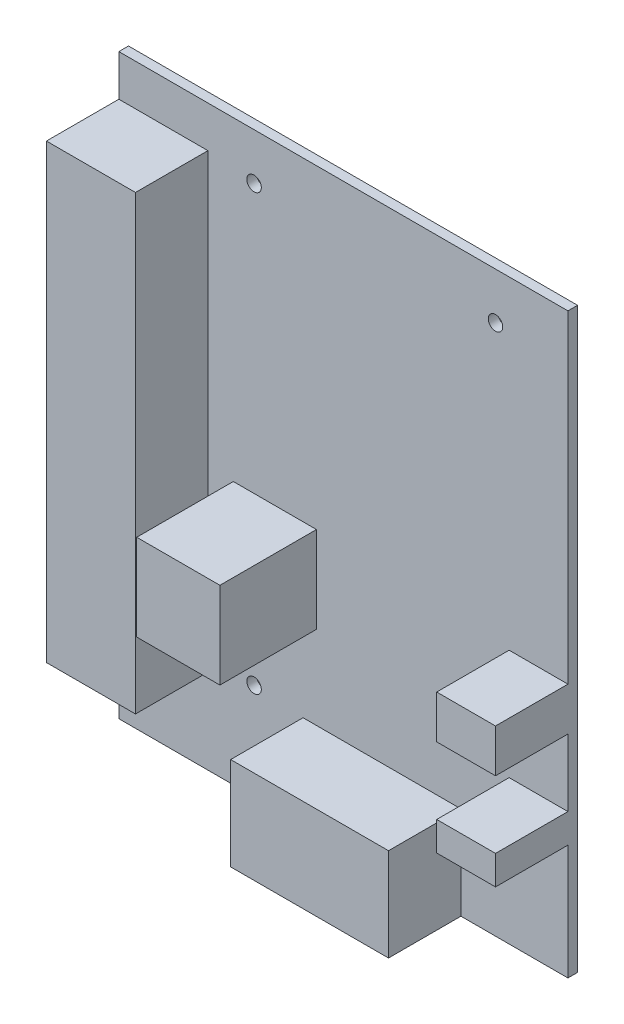
ISO-10303-21;
HEADER;
FILE_DESCRIPTION(('STEP AP214'),'2;1');
FILE_NAME('part.step','',(''),(''),'','','');
FILE_SCHEMA(('AUTOMOTIVE_DESIGN { 1 0 10303 214 1 1 1 1 }'));
ENDSEC;
DATA;
#1=APPLICATION_CONTEXT('core data for automotive mechanical design processes');
#2=APPLICATION_PROTOCOL_DEFINITION('international standard','automotive_design',2000,#1);
#3=PRODUCT_CONTEXT('',#1,'mechanical');
#4=PRODUCT('Part','Part','',(#3));
#5=PRODUCT_RELATED_PRODUCT_CATEGORY('part','',(#4));
#6=PRODUCT_DEFINITION_FORMATION('','',#4);
#7=PRODUCT_DEFINITION_CONTEXT('part definition',#1,'design');
#8=PRODUCT_DEFINITION('design','',#6,#7);
#9=PRODUCT_DEFINITION_SHAPE('','',#8);
#10=(LENGTH_UNIT() NAMED_UNIT(*) SI_UNIT(.MILLI.,.METRE.));
#11=(NAMED_UNIT(*) PLANE_ANGLE_UNIT() SI_UNIT($,.RADIAN.));
#12=(NAMED_UNIT(*) SI_UNIT($,.STERADIAN.) SOLID_ANGLE_UNIT());
#13=UNCERTAINTY_MEASURE_WITH_UNIT(LENGTH_MEASURE(1.E-05),#10,'distance_accuracy_value','');
#14=(GEOMETRIC_REPRESENTATION_CONTEXT(3) GLOBAL_UNCERTAINTY_ASSIGNED_CONTEXT((#13)) GLOBAL_UNIT_ASSIGNED_CONTEXT((#10,
#11,#12)) REPRESENTATION_CONTEXT('',''));
#15=CARTESIAN_POINT('',(0.,0.,0.));
#16=DIRECTION('',(0.,0.,1.));
#17=DIRECTION('',(1.,0.,0.));
#18=AXIS2_PLACEMENT_3D('',#15,#16,#17);
#19=CARTESIAN_POINT('',(0.,0.,2.));
#20=DIRECTION('',(0.,0.,1.));
#21=DIRECTION('',(1.,0.,0.));
#22=AXIS2_PLACEMENT_3D('',#19,#20,#21);
#23=PLANE('',#22);
#24=CARTESIAN_POINT('',(11.7886178861789,-47.520325203252,2.));
#25=DIRECTION('',(0.,0.,1.));
#26=DIRECTION('',(1.,0.,0.));
#27=AXIS2_PLACEMENT_3D('',#24,#25,#26);
#28=CIRCLE('',#27,1.5);
#29=CARTESIAN_POINT('',(13.2886178861789,-47.520325203252,2.));
#30=VERTEX_POINT('',#29);
#31=EDGE_CURVE('E350',#30,#30,#28,.T.);
#32=ORIENTED_EDGE('',*,*,#31,.F.);
#33=EDGE_LOOP('',(#32));
#34=FACE_BOUND('',#33,.T.);
#35=CARTESIAN_POINT('',(-38.2113821138211,42.479674796748,2.));
#36=DIRECTION('',(0.,0.,1.));
#37=DIRECTION('',(1.,0.,0.));
#38=AXIS2_PLACEMENT_3D('',#35,#36,#37);
#39=CIRCLE('',#38,1.5);
#40=CARTESIAN_POINT('',(-36.7113821138211,42.479674796748,2.));
#41=VERTEX_POINT('',#40);
#42=EDGE_CURVE('E362',#41,#41,#39,.T.);
#43=ORIENTED_EDGE('',*,*,#42,.F.);
#44=EDGE_LOOP('',(#43));
#45=FACE_BOUND('',#44,.T.);
#46=CARTESIAN_POINT('',(11.7886178861789,42.479674796748,2.));
#47=DIRECTION('',(0.,0.,1.));
#48=DIRECTION('',(1.,0.,0.));
#49=AXIS2_PLACEMENT_3D('',#46,#47,#48);
#50=CIRCLE('',#49,1.5);
#51=CARTESIAN_POINT('',(13.2886178861789,42.479674796748,2.));
#52=VERTEX_POINT('',#51);
#53=EDGE_CURVE('E356',#52,#52,#50,.T.);
#54=ORIENTED_EDGE('',*,*,#53,.F.);
#55=EDGE_LOOP('',(#54));
#56=FACE_BOUND('',#55,.T.);
#57=CARTESIAN_POINT('',(-38.2113821138211,-47.520325203252,2.));
#58=DIRECTION('',(0.,0.,1.));
#59=DIRECTION('',(1.,0.,0.));
#60=AXIS2_PLACEMENT_3D('',#57,#58,#59);
#61=CIRCLE('',#60,1.5);
#62=CARTESIAN_POINT('',(-36.7113821138211,-47.520325203252,2.));
#63=VERTEX_POINT('',#62);
#64=EDGE_CURVE('E344',#63,#63,#61,.T.);
#65=ORIENTED_EDGE('',*,*,#64,.F.);
#66=EDGE_LOOP('',(#65));
#67=FACE_BOUND('',#66,.T.);
#68=DIRECTION('',(0.,-1.,0.));
#69=VECTOR('',#68,1.);
#70=CARTESIAN_POINT('',(14.6130124071462,-37.6723514818877,2.));
#71=LINE('',#70,#69);
#72=CARTESIAN_POINT('',(14.6130124071462,-37.6723514818877,2.));
#73=VERTEX_POINT('',#72);
#74=CARTESIAN_POINT('',(14.6130124071462,-43.6898195221715,2.));
#75=VERTEX_POINT('',#74);
#76=EDGE_CURVE('E58',#73,#75,#71,.T.);
#77=ORIENTED_EDGE('',*,*,#76,.F.);
#78=DIRECTION('',(-1.,0.,0.));
#79=VECTOR('',#78,1.);
#80=CARTESIAN_POINT('',(26.7886178861789,-37.6723514818877,2.));
#81=LINE('',#80,#79);
#82=CARTESIAN_POINT('',(26.7886178861789,-37.6723514818877,2.));
#83=VERTEX_POINT('',#82);
#84=EDGE_CURVE('E222',#83,#73,#81,.T.);
#85=ORIENTED_EDGE('',*,*,#84,.F.);
#86=DIRECTION('',(0.,1.,0.));
#87=VECTOR('',#86,1.);
#88=CARTESIAN_POINT('',(26.7886178861789,-67.520325203252,2.));
#89=LINE('',#88,#87);
#90=CARTESIAN_POINT('',(26.7886178861789,-23.7590006646258,2.));
#91=VERTEX_POINT('',#90);
#92=EDGE_CURVE('E378',#83,#91,#89,.T.);
#93=ORIENTED_EDGE('',*,*,#92,.T.);
#94=DIRECTION('',(1.,0.,0.));
#95=VECTOR('',#94,1.);
#96=CARTESIAN_POINT('',(26.7886178861789,-23.7590006646258,2.));
#97=LINE('',#96,#95);
#98=CARTESIAN_POINT('',(14.6130124071462,-23.7590006646258,2.));
#99=VERTEX_POINT('',#98);
#100=EDGE_CURVE('E258',#99,#91,#97,.T.);
#101=ORIENTED_EDGE('',*,*,#100,.F.);
#102=DIRECTION('',(0.,-1.,0.));
#103=VECTOR('',#102,1.);
#104=CARTESIAN_POINT('',(14.6130124071462,-14.8190353320672,2.));
#105=LINE('',#104,#103);
#106=CARTESIAN_POINT('',(14.6130124071462,-14.8190353320672,2.));
#107=VERTEX_POINT('',#106);
#108=EDGE_CURVE('E267',#107,#99,#105,.T.);
#109=ORIENTED_EDGE('',*,*,#108,.F.);
#110=DIRECTION('',(-1.,0.,0.));
#111=VECTOR('',#110,1.);
#112=CARTESIAN_POINT('',(26.7886178861789,-14.8190353320672,2.));
#113=LINE('',#112,#111);
#114=CARTESIAN_POINT('',(26.7886178861789,-14.8190353320672,2.));
#115=VERTEX_POINT('',#114);
#116=EDGE_CURVE('E253',#115,#107,#113,.T.);
#117=ORIENTED_EDGE('',*,*,#116,.F.);
#118=CARTESIAN_POINT('',(26.7886178861789,52.1313007976159,2.));
#119=VERTEX_POINT('',#118);
#120=EDGE_CURVE('E374',#115,#119,#89,.T.);
#121=ORIENTED_EDGE('',*,*,#120,.T.);
#122=DIRECTION('',(-1.,0.,0.));
#123=VECTOR('',#122,1.);
#124=CARTESIAN_POINT('',(26.7886178861789,52.1313007976159,2.));
#125=LINE('',#124,#123);
#126=CARTESIAN_POINT('',(-66.2113821138211,52.1313007976159,2.));
#127=VERTEX_POINT('',#126);
#128=EDGE_CURVE('E377',#119,#127,#125,.T.);
#129=ORIENTED_EDGE('',*,*,#128,.T.);
#130=DIRECTION('',(0.,-1.,0.));
#131=VECTOR('',#130,1.);
#132=CARTESIAN_POINT('',(-66.2113821138211,52.1313007976159,2.));
#133=LINE('',#132,#131);
#134=CARTESIAN_POINT('',(-66.2113821138211,43.587482514738,2.));
#135=VERTEX_POINT('',#134);
#136=EDGE_CURVE('E368',#127,#135,#133,.T.);
#137=ORIENTED_EDGE('',*,*,#136,.T.);
#138=DIRECTION('',(-1.,0.,0.));
#139=VECTOR('',#138,1.);
#140=CARTESIAN_POINT('',(-66.2113821138211,43.587482514738,2.));
#141=LINE('',#140,#139);
#142=CARTESIAN_POINT('',(-47.7663460084941,43.587482514738,2.));
#143=VERTEX_POINT('',#142);
#144=EDGE_CURVE('E318',#143,#135,#141,.T.);
#145=ORIENTED_EDGE('',*,*,#144,.F.);
#146=DIRECTION('',(0.,1.,0.));
#147=VECTOR('',#146,1.);
#148=CARTESIAN_POINT('',(-47.7663460084941,43.587482514738,2.));
#149=LINE('',#148,#147);
#150=CARTESIAN_POINT('',(-47.7663460084941,-49.94853421681,2.));
#151=VERTEX_POINT('',#150);
#152=EDGE_CURVE('E327',#151,#143,#149,.T.);
#153=ORIENTED_EDGE('',*,*,#152,.F.);
#154=DIRECTION('',(1.,0.,0.));
#155=VECTOR('',#154,1.);
#156=CARTESIAN_POINT('',(-66.2113821138211,-49.94853421681,2.));
#157=LINE('',#156,#155);
#158=CARTESIAN_POINT('',(-66.2113821138211,-49.94853421681,2.));
#159=VERTEX_POINT('',#158);
#160=EDGE_CURVE('E313',#159,#151,#157,.T.);
#161=ORIENTED_EDGE('',*,*,#160,.F.);
#162=CARTESIAN_POINT('',(-66.2113821138211,-67.520325203252,2.));
#163=VERTEX_POINT('',#162);
#164=EDGE_CURVE('E371',#159,#163,#133,.T.);
#165=ORIENTED_EDGE('',*,*,#164,.T.);
#166=DIRECTION('',(1.,0.,0.));
#167=VECTOR('',#166,1.);
#168=CARTESIAN_POINT('',(-66.2113821138211,-67.520325203252,2.));
#169=LINE('',#168,#167);
#170=CARTESIAN_POINT('',(-28.0622060267035,-67.520325203252,2.));
#171=VERTEX_POINT('',#170);
#172=EDGE_CURVE('E372',#163,#171,#169,.T.);
#173=ORIENTED_EDGE('',*,*,#172,.T.);
#174=DIRECTION('',(0.,-1.,0.));
#175=VECTOR('',#174,1.);
#176=CARTESIAN_POINT('',(-28.0622060267035,-67.520325203252,2.));
#177=LINE('',#176,#175);
#178=CARTESIAN_POINT('',(-28.0622060267035,-48.2675980983061,2.));
#179=VERTEX_POINT('',#178);
#180=EDGE_CURVE('E283',#179,#171,#177,.T.);
#181=ORIENTED_EDGE('',*,*,#180,.F.);
#182=DIRECTION('',(-1.,0.,0.));
#183=VECTOR('',#182,1.);
#184=CARTESIAN_POINT('',(-28.0622060267035,-48.2675980983061,2.));
#185=LINE('',#184,#183);
#186=CARTESIAN_POINT('',(4.63272007510085,-48.2675980983061,2.));
#187=VERTEX_POINT('',#186);
#188=EDGE_CURVE('E288',#187,#179,#185,.T.);
#189=ORIENTED_EDGE('',*,*,#188,.F.);
#190=DIRECTION('',(0.,1.,0.));
#191=VECTOR('',#190,1.);
#192=CARTESIAN_POINT('',(4.63272007510085,-67.520325203252,2.));
#193=LINE('',#192,#191);
#194=CARTESIAN_POINT('',(4.63272007510085,-67.520325203252,2.));
#195=VERTEX_POINT('',#194);
#196=EDGE_CURVE('E297',#195,#187,#193,.T.);
#197=ORIENTED_EDGE('',*,*,#196,.F.);
#198=CARTESIAN_POINT('',(26.7886178861789,-67.520325203252,2.));
#199=VERTEX_POINT('',#198);
#200=EDGE_CURVE('E370',#195,#199,#169,.T.);
#201=ORIENTED_EDGE('',*,*,#200,.T.);
#202=CARTESIAN_POINT('',(26.7886178861789,-43.6898195221715,2.));
#203=VERTEX_POINT('',#202);
#204=EDGE_CURVE('E375',#199,#203,#89,.T.);
#205=ORIENTED_EDGE('',*,*,#204,.T.);
#206=DIRECTION('',(1.,0.,0.));
#207=VECTOR('',#206,1.);
#208=CARTESIAN_POINT('',(26.7886178861789,-43.6898195221715,2.));
#209=LINE('',#208,#207);
#210=EDGE_CURVE('E232',#75,#203,#209,.T.);
#211=ORIENTED_EDGE('',*,*,#210,.F.);
#212=EDGE_LOOP('',(#77,#85,#93,#101,#109,#117,#121,#129,#137,#145,#153,#161,#165,#173,#181,#189,
#197,#201,#205,#211));
#213=FACE_BOUND('',#212,.T.);
#214=DIRECTION('',(1.,0.,0.));
#215=VECTOR('',#214,1.);
#216=CARTESIAN_POINT('',(-42.5094074935259,-31.0234944987826,2.));
#217=LINE('',#216,#215);
#218=CARTESIAN_POINT('',(-42.5094074935259,-31.0234944987826,2.));
#219=VERTEX_POINT('',#218);
#220=CARTESIAN_POINT('',(-25.2848773989953,-31.0234944987826,2.));
#221=VERTEX_POINT('',#220);
#222=EDGE_CURVE('E701',#219,#221,#217,.T.);
#223=ORIENTED_EDGE('',*,*,#222,.F.);
#224=DIRECTION('',(0.,-1.,0.));
#225=VECTOR('',#224,1.);
#226=CARTESIAN_POINT('',(-42.5094074935259,-13.1227012852833,2.));
#227=LINE('',#226,#225);
#228=CARTESIAN_POINT('',(-42.5094074935259,-13.1227012852833,2.));
#229=VERTEX_POINT('',#228);
#230=EDGE_CURVE('E220',#229,#219,#227,.T.);
#231=ORIENTED_EDGE('',*,*,#230,.F.);
#232=DIRECTION('',(-1.,0.,0.));
#233=VECTOR('',#232,1.);
#234=CARTESIAN_POINT('',(-42.5094074935259,-13.1227012852833,2.));
#235=LINE('',#234,#233);
#236=CARTESIAN_POINT('',(-25.2848773989953,-13.1227012852833,2.));
#237=VERTEX_POINT('',#236);
#238=EDGE_CURVE('E216',#237,#229,#235,.T.);
#239=ORIENTED_EDGE('',*,*,#238,.F.);
#240=DIRECTION('',(0.,1.,0.));
#241=VECTOR('',#240,1.);
#242=CARTESIAN_POINT('',(-25.2848773989953,-13.1227012852833,2.));
#243=LINE('',#242,#241);
#244=EDGE_CURVE('E698',#221,#237,#243,.T.);
#245=ORIENTED_EDGE('',*,*,#244,.F.);
#246=EDGE_LOOP('',(#223,#231,#239,#245));
#247=FACE_BOUND('',#246,.T.);
#248=ADVANCED_FACE('F35',(#34,#45,#56,#67,#213,#247),#23,.T.);
#249=CARTESIAN_POINT('',(0.,0.,0.));
#250=DIRECTION('',(0.,0.,1.));
#251=DIRECTION('',(1.,0.,0.));
#252=AXIS2_PLACEMENT_3D('',#249,#250,#251);
#253=PLANE('',#252);
#254=DIRECTION('',(0.,-1.,0.));
#255=VECTOR('',#254,1.);
#256=CARTESIAN_POINT('',(-66.2113821138211,-47.520325203252,0.));
#257=LINE('',#256,#255);
#258=CARTESIAN_POINT('',(-66.2113821138211,52.1313007976159,0.));
#259=VERTEX_POINT('',#258);
#260=CARTESIAN_POINT('',(-66.2113821138211,-67.520325203252,0.));
#261=VERTEX_POINT('',#260);
#262=EDGE_CURVE('E365',#259,#261,#257,.T.);
#263=ORIENTED_EDGE('',*,*,#262,.F.);
#264=DIRECTION('',(-1.,0.,0.));
#265=VECTOR('',#264,1.);
#266=CARTESIAN_POINT('',(26.7886178861789,52.1313007976159,0.));
#267=LINE('',#266,#265);
#268=CARTESIAN_POINT('',(26.7886178861789,52.1313007976159,0.));
#269=VERTEX_POINT('',#268);
#270=EDGE_CURVE('E388',#269,#259,#267,.T.);
#271=ORIENTED_EDGE('',*,*,#270,.F.);
#272=DIRECTION('',(0.,1.,0.));
#273=VECTOR('',#272,1.);
#274=CARTESIAN_POINT('',(26.7886178861789,42.479674796748,0.));
#275=LINE('',#274,#273);
#276=CARTESIAN_POINT('',(26.7886178861789,-67.520325203252,0.));
#277=VERTEX_POINT('',#276);
#278=EDGE_CURVE('E386',#277,#269,#275,.T.);
#279=ORIENTED_EDGE('',*,*,#278,.F.);
#280=DIRECTION('',(1.,0.,0.));
#281=VECTOR('',#280,1.);
#282=CARTESIAN_POINT('',(11.7886178861789,-67.520325203252,0.));
#283=LINE('',#282,#281);
#284=EDGE_CURVE('E383',#261,#277,#283,.T.);
#285=ORIENTED_EDGE('',*,*,#284,.F.);
#286=EDGE_LOOP('',(#263,#271,#279,#285));
#287=FACE_BOUND('',#286,.T.);
#288=CARTESIAN_POINT('',(-38.2113821138211,42.479674796748,0.));
#289=DIRECTION('',(0.,0.,1.));
#290=DIRECTION('',(1.,0.,0.));
#291=AXIS2_PLACEMENT_3D('',#288,#289,#290);
#292=CIRCLE('',#291,1.5);
#293=CARTESIAN_POINT('',(-36.7113821138211,42.479674796748,0.));
#294=VERTEX_POINT('',#293);
#295=EDGE_CURVE('E359',#294,#294,#292,.T.);
#296=ORIENTED_EDGE('',*,*,#295,.T.);
#297=EDGE_LOOP('',(#296));
#298=FACE_BOUND('',#297,.T.);
#299=CARTESIAN_POINT('',(11.7886178861789,42.479674796748,0.));
#300=DIRECTION('',(0.,0.,1.));
#301=DIRECTION('',(1.,0.,0.));
#302=AXIS2_PLACEMENT_3D('',#299,#300,#301);
#303=CIRCLE('',#302,1.5);
#304=CARTESIAN_POINT('',(13.2886178861789,42.479674796748,0.));
#305=VERTEX_POINT('',#304);
#306=EDGE_CURVE('E353',#305,#305,#303,.T.);
#307=ORIENTED_EDGE('',*,*,#306,.T.);
#308=EDGE_LOOP('',(#307));
#309=FACE_BOUND('',#308,.T.);
#310=CARTESIAN_POINT('',(11.7886178861789,-47.520325203252,0.));
#311=DIRECTION('',(0.,0.,1.));
#312=DIRECTION('',(1.,0.,0.));
#313=AXIS2_PLACEMENT_3D('',#310,#311,#312);
#314=CIRCLE('',#313,1.5);
#315=CARTESIAN_POINT('',(13.2886178861789,-47.520325203252,0.));
#316=VERTEX_POINT('',#315);
#317=EDGE_CURVE('E347',#316,#316,#314,.T.);
#318=ORIENTED_EDGE('',*,*,#317,.T.);
#319=EDGE_LOOP('',(#318));
#320=FACE_BOUND('',#319,.T.);
#321=CARTESIAN_POINT('',(-38.2113821138211,-47.520325203252,0.));
#322=DIRECTION('',(0.,0.,1.));
#323=DIRECTION('',(1.,0.,0.));
#324=AXIS2_PLACEMENT_3D('',#321,#322,#323);
#325=CIRCLE('',#324,1.5);
#326=CARTESIAN_POINT('',(-36.7113821138211,-47.520325203252,0.));
#327=VERTEX_POINT('',#326);
#328=EDGE_CURVE('E343',#327,#327,#325,.T.);
#329=ORIENTED_EDGE('',*,*,#328,.T.);
#330=EDGE_LOOP('',(#329));
#331=FACE_BOUND('',#330,.T.);
#332=ADVANCED_FACE('F408',(#287,#298,#309,#320,#331),#253,.F.);
#333=CARTESIAN_POINT('',(-66.2113821138211,-47.520325203252,2.));
#334=DIRECTION('',(1.,0.,0.));
#335=DIRECTION('',(0.,0.,-1.));
#336=AXIS2_PLACEMENT_3D('',#333,#334,#335);
#337=PLANE('',#336);
#338=ORIENTED_EDGE('',*,*,#262,.T.);
#339=DIRECTION('',(0.,0.,-1.));
#340=VECTOR('',#339,1.);
#341=CARTESIAN_POINT('',(-66.2113821138211,-67.520325203252,2.));
#342=LINE('',#341,#340);
#343=EDGE_CURVE('E11',#163,#261,#342,.T.);
#344=ORIENTED_EDGE('',*,*,#343,.F.);
#345=ORIENTED_EDGE('',*,*,#164,.F.);
#346=DIRECTION('',(0.,0.,-1.));
#347=VECTOR('',#346,1.);
#348=CARTESIAN_POINT('',(-66.2113821138211,-49.94853421681,17.));
#349=LINE('',#348,#347);
#350=CARTESIAN_POINT('',(-66.2113821138211,-49.94853421681,17.));
#351=VERTEX_POINT('',#350);
#352=EDGE_CURVE('E340',#351,#159,#349,.T.);
#353=ORIENTED_EDGE('',*,*,#352,.F.);
#354=DIRECTION('',(0.,-1.,0.));
#355=VECTOR('',#354,1.);
#356=CARTESIAN_POINT('',(-66.2113821138211,43.587482514738,17.));
#357=LINE('',#356,#355);
#358=CARTESIAN_POINT('',(-66.2113821138211,43.587482514738,17.));
#359=VERTEX_POINT('',#358);
#360=EDGE_CURVE('E314',#359,#351,#357,.T.);
#361=ORIENTED_EDGE('',*,*,#360,.F.);
#362=DIRECTION('',(0.,0.,-1.));
#363=VECTOR('',#362,1.);
#364=CARTESIAN_POINT('',(-66.2113821138211,43.587482514738,17.));
#365=LINE('',#364,#363);
#366=EDGE_CURVE('E324',#359,#135,#365,.T.);
#367=ORIENTED_EDGE('',*,*,#366,.T.);
#368=ORIENTED_EDGE('',*,*,#136,.F.);
#369=DIRECTION('',(0.,0.,-1.));
#370=VECTOR('',#369,1.);
#371=CARTESIAN_POINT('',(-66.2113821138211,52.1313007976159,2.));
#372=LINE('',#371,#370);
#373=EDGE_CURVE('E380',#127,#259,#372,.T.);
#374=ORIENTED_EDGE('',*,*,#373,.T.);
#375=EDGE_LOOP('',(#338,#344,#345,#353,#361,#367,#368,#374));
#376=FACE_BOUND('',#375,.T.);
#377=ADVANCED_FACE('F37',(#376),#337,.F.);
#378=CARTESIAN_POINT('',(11.7886178861789,-67.520325203252,2.));
#379=DIRECTION('',(0.,1.,0.));
#380=DIRECTION('',(0.,0.,1.));
#381=AXIS2_PLACEMENT_3D('',#378,#379,#380);
#382=PLANE('',#381);
#383=ORIENTED_EDGE('',*,*,#284,.T.);
#384=DIRECTION('',(0.,0.,-1.));
#385=VECTOR('',#384,1.);
#386=CARTESIAN_POINT('',(26.7886178861789,-67.520325203252,2.));
#387=LINE('',#386,#385);
#388=EDGE_CURVE('E43',#199,#277,#387,.T.);
#389=ORIENTED_EDGE('',*,*,#388,.F.);
#390=ORIENTED_EDGE('',*,*,#200,.F.);
#391=DIRECTION('',(0.,0.,-1.));
#392=VECTOR('',#391,1.);
#393=CARTESIAN_POINT('',(4.63272007510085,-67.520325203252,17.));
#394=LINE('',#393,#392);
#395=CARTESIAN_POINT('',(4.63272007510085,-67.520325203252,17.));
#396=VERTEX_POINT('',#395);
#397=EDGE_CURVE('E307',#396,#195,#394,.T.);
#398=ORIENTED_EDGE('',*,*,#397,.F.);
#399=DIRECTION('',(1.,0.,0.));
#400=VECTOR('',#399,1.);
#401=CARTESIAN_POINT('',(-28.0622060267035,-67.520325203252,17.));
#402=LINE('',#401,#400);
#403=CARTESIAN_POINT('',(-28.0622060267035,-67.520325203252,17.));
#404=VERTEX_POINT('',#403);
#405=EDGE_CURVE('E287',#404,#396,#402,.T.);
#406=ORIENTED_EDGE('',*,*,#405,.F.);
#407=DIRECTION('',(0.,0.,-1.));
#408=VECTOR('',#407,1.);
#409=CARTESIAN_POINT('',(-28.0622060267035,-67.520325203252,17.));
#410=LINE('',#409,#408);
#411=EDGE_CURVE('E310',#404,#171,#410,.T.);
#412=ORIENTED_EDGE('',*,*,#411,.T.);
#413=ORIENTED_EDGE('',*,*,#172,.F.);
#414=ORIENTED_EDGE('',*,*,#343,.T.);
#415=EDGE_LOOP('',(#383,#389,#390,#398,#406,#412,#413,#414));
#416=FACE_BOUND('',#415,.T.);
#417=ADVANCED_FACE('F402',(#416),#382,.F.);
#418=CARTESIAN_POINT('',(26.7886178861789,42.479674796748,2.));
#419=DIRECTION('',(-1.,0.,0.));
#420=DIRECTION('',(0.,0.,1.));
#421=AXIS2_PLACEMENT_3D('',#418,#419,#420);
#422=PLANE('',#421);
#423=ORIENTED_EDGE('',*,*,#278,.T.);
#424=DIRECTION('',(0.,0.,-1.));
#425=VECTOR('',#424,1.);
#426=CARTESIAN_POINT('',(26.7886178861789,52.1313007976159,2.));
#427=LINE('',#426,#425);
#428=EDGE_CURVE('E393',#119,#269,#427,.T.);
#429=ORIENTED_EDGE('',*,*,#428,.F.);
#430=ORIENTED_EDGE('',*,*,#120,.F.);
#431=DIRECTION('',(0.,0.,-1.));
#432=VECTOR('',#431,1.);
#433=CARTESIAN_POINT('',(26.7886178861789,-14.8190353320672,17.));
#434=LINE('',#433,#432);
#435=CARTESIAN_POINT('',(26.7886178861789,-14.8190353320672,17.));
#436=VERTEX_POINT('',#435);
#437=EDGE_CURVE('E280',#436,#115,#434,.T.);
#438=ORIENTED_EDGE('',*,*,#437,.F.);
#439=DIRECTION('',(0.,1.,0.));
#440=VECTOR('',#439,1.);
#441=CARTESIAN_POINT('',(26.7886178861789,-14.8190353320672,17.));
#442=LINE('',#441,#440);
#443=CARTESIAN_POINT('',(26.7886178861789,-23.7590006646258,17.));
#444=VERTEX_POINT('',#443);
#445=EDGE_CURVE('E254',#444,#436,#442,.T.);
#446=ORIENTED_EDGE('',*,*,#445,.F.);
#447=DIRECTION('',(0.,0.,-1.));
#448=VECTOR('',#447,1.);
#449=CARTESIAN_POINT('',(26.7886178861789,-23.7590006646258,17.));
#450=LINE('',#449,#448);
#451=EDGE_CURVE('E264',#444,#91,#450,.T.);
#452=ORIENTED_EDGE('',*,*,#451,.T.);
#453=ORIENTED_EDGE('',*,*,#92,.F.);
#454=DIRECTION('',(0.,0.,-1.));
#455=VECTOR('',#454,1.);
#456=CARTESIAN_POINT('',(26.7886178861789,-37.6723514818877,17.));
#457=LINE('',#456,#455);
#458=CARTESIAN_POINT('',(26.7886178861789,-37.6723514818877,17.));
#459=VERTEX_POINT('',#458);
#460=EDGE_CURVE('E250',#459,#83,#457,.T.);
#461=ORIENTED_EDGE('',*,*,#460,.F.);
#462=DIRECTION('',(0.,1.,0.));
#463=VECTOR('',#462,1.);
#464=CARTESIAN_POINT('',(26.7886178861789,-37.6723514818877,17.));
#465=LINE('',#464,#463);
#466=CARTESIAN_POINT('',(26.7886178861789,-43.6898195221715,17.));
#467=VERTEX_POINT('',#466);
#468=EDGE_CURVE('E228',#467,#459,#465,.T.);
#469=ORIENTED_EDGE('',*,*,#468,.F.);
#470=DIRECTION('',(0.,0.,-1.));
#471=VECTOR('',#470,1.);
#472=CARTESIAN_POINT('',(26.7886178861789,-43.6898195221715,17.));
#473=LINE('',#472,#471);
#474=EDGE_CURVE('E237',#467,#203,#473,.T.);
#475=ORIENTED_EDGE('',*,*,#474,.T.);
#476=ORIENTED_EDGE('',*,*,#204,.F.);
#477=ORIENTED_EDGE('',*,*,#388,.T.);
#478=EDGE_LOOP('',(#423,#429,#430,#438,#446,#452,#453,#461,#469,#475,#476,#477));
#479=FACE_BOUND('',#478,.T.);
#480=ADVANCED_FACE('F399',(#479),#422,.F.);
#481=CARTESIAN_POINT('',(26.7886178861789,52.1313007976159,2.));
#482=DIRECTION('',(0.,-1.,0.));
#483=DIRECTION('',(0.,0.,-1.));
#484=AXIS2_PLACEMENT_3D('',#481,#482,#483);
#485=PLANE('',#484);
#486=ORIENTED_EDGE('',*,*,#270,.T.);
#487=ORIENTED_EDGE('',*,*,#373,.F.);
#488=ORIENTED_EDGE('',*,*,#128,.F.);
#489=ORIENTED_EDGE('',*,*,#428,.T.);
#490=EDGE_LOOP('',(#486,#487,#488,#489));
#491=FACE_BOUND('',#490,.T.);
#492=ADVANCED_FACE('F417',(#491),#485,.F.);
#493=CARTESIAN_POINT('',(-38.2113821138211,42.479674796748,2.));
#494=DIRECTION('',(0.,0.,-1.));
#495=DIRECTION('',(-1.,0.,0.));
#496=AXIS2_PLACEMENT_3D('',#493,#494,#495);
#497=CYLINDRICAL_SURFACE('',#496,1.5);
#498=ORIENTED_EDGE('',*,*,#42,.T.);
#499=EDGE_LOOP('',(#498));
#500=FACE_BOUND('',#499,.T.);
#501=ORIENTED_EDGE('',*,*,#295,.F.);
#502=EDGE_LOOP('',(#501));
#503=FACE_BOUND('',#502,.T.);
#504=ADVANCED_FACE('F455',(#500,#503),#497,.F.);
#505=CARTESIAN_POINT('',(11.7886178861789,42.479674796748,2.));
#506=DIRECTION('',(0.,0.,-1.));
#507=DIRECTION('',(-1.,0.,0.));
#508=AXIS2_PLACEMENT_3D('',#505,#506,#507);
#509=CYLINDRICAL_SURFACE('',#508,1.5);
#510=ORIENTED_EDGE('',*,*,#53,.T.);
#511=EDGE_LOOP('',(#510));
#512=FACE_BOUND('',#511,.T.);
#513=ORIENTED_EDGE('',*,*,#306,.F.);
#514=EDGE_LOOP('',(#513));
#515=FACE_BOUND('',#514,.T.);
#516=ADVANCED_FACE('F489',(#512,#515),#509,.F.);
#517=CARTESIAN_POINT('',(11.7886178861789,-47.520325203252,2.));
#518=DIRECTION('',(0.,0.,-1.));
#519=DIRECTION('',(-1.,0.,0.));
#520=AXIS2_PLACEMENT_3D('',#517,#518,#519);
#521=CYLINDRICAL_SURFACE('',#520,1.5);
#522=ORIENTED_EDGE('',*,*,#31,.T.);
#523=EDGE_LOOP('',(#522));
#524=FACE_BOUND('',#523,.T.);
#525=ORIENTED_EDGE('',*,*,#317,.F.);
#526=EDGE_LOOP('',(#525));
#527=FACE_BOUND('',#526,.T.);
#528=ADVANCED_FACE('F498',(#524,#527),#521,.F.);
#529=CARTESIAN_POINT('',(-38.2113821138211,-47.520325203252,2.));
#530=DIRECTION('',(0.,0.,-1.));
#531=DIRECTION('',(-1.,0.,0.));
#532=AXIS2_PLACEMENT_3D('',#529,#530,#531);
#533=CYLINDRICAL_SURFACE('',#532,1.5);
#534=ORIENTED_EDGE('',*,*,#64,.T.);
#535=EDGE_LOOP('',(#534));
#536=FACE_BOUND('',#535,.T.);
#537=ORIENTED_EDGE('',*,*,#328,.F.);
#538=EDGE_LOOP('',(#537));
#539=FACE_BOUND('',#538,.T.);
#540=ADVANCED_FACE('F506',(#536,#539),#533,.F.);
#541=CARTESIAN_POINT('',(-66.2113821138211,-49.94853421681,17.));
#542=DIRECTION('',(0.,1.,0.));
#543=DIRECTION('',(0.,0.,1.));
#544=AXIS2_PLACEMENT_3D('',#541,#542,#543);
#545=PLANE('',#544);
#546=ORIENTED_EDGE('',*,*,#160,.T.);
#547=DIRECTION('',(0.,0.,-1.));
#548=VECTOR('',#547,1.);
#549=CARTESIAN_POINT('',(-47.7663460084941,-49.94853421681,17.));
#550=LINE('',#549,#548);
#551=CARTESIAN_POINT('',(-47.7663460084941,-49.94853421681,17.));
#552=VERTEX_POINT('',#551);
#553=EDGE_CURVE('E337',#552,#151,#550,.T.);
#554=ORIENTED_EDGE('',*,*,#553,.F.);
#555=DIRECTION('',(1.,0.,0.));
#556=VECTOR('',#555,1.);
#557=CARTESIAN_POINT('',(-66.2113821138211,-49.94853421681,17.));
#558=LINE('',#557,#556);
#559=EDGE_CURVE('E317',#351,#552,#558,.T.);
#560=ORIENTED_EDGE('',*,*,#559,.F.);
#561=ORIENTED_EDGE('',*,*,#352,.T.);
#562=EDGE_LOOP('',(#546,#554,#560,#561));
#563=FACE_BOUND('',#562,.T.);
#564=ADVANCED_FACE('F515',(#563),#545,.F.);
#565=CARTESIAN_POINT('',(-47.7663460084941,43.587482514738,17.));
#566=DIRECTION('',(-1.,0.,0.));
#567=DIRECTION('',(0.,0.,1.));
#568=AXIS2_PLACEMENT_3D('',#565,#566,#567);
#569=PLANE('',#568);
#570=ORIENTED_EDGE('',*,*,#152,.T.);
#571=DIRECTION('',(0.,0.,-1.));
#572=VECTOR('',#571,1.);
#573=CARTESIAN_POINT('',(-47.7663460084941,43.587482514738,17.));
#574=LINE('',#573,#572);
#575=CARTESIAN_POINT('',(-47.7663460084941,43.587482514738,17.));
#576=VERTEX_POINT('',#575);
#577=EDGE_CURVE('E334',#576,#143,#574,.T.);
#578=ORIENTED_EDGE('',*,*,#577,.F.);
#579=DIRECTION('',(0.,1.,0.));
#580=VECTOR('',#579,1.);
#581=CARTESIAN_POINT('',(-47.7663460084941,43.587482514738,17.));
#582=LINE('',#581,#580);
#583=EDGE_CURVE('E320',#552,#576,#582,.T.);
#584=ORIENTED_EDGE('',*,*,#583,.F.);
#585=ORIENTED_EDGE('',*,*,#553,.T.);
#586=EDGE_LOOP('',(#570,#578,#584,#585));
#587=FACE_BOUND('',#586,.T.);
#588=ADVANCED_FACE('F525',(#587),#569,.F.);
#589=CARTESIAN_POINT('',(-66.2113821138211,43.587482514738,17.));
#590=DIRECTION('',(0.,-1.,0.));
#591=DIRECTION('',(0.,0.,-1.));
#592=AXIS2_PLACEMENT_3D('',#589,#590,#591);
#593=PLANE('',#592);
#594=ORIENTED_EDGE('',*,*,#144,.T.);
#595=ORIENTED_EDGE('',*,*,#366,.F.);
#596=DIRECTION('',(-1.,0.,0.));
#597=VECTOR('',#596,1.);
#598=CARTESIAN_POINT('',(-66.2113821138211,43.587482514738,17.));
#599=LINE('',#598,#597);
#600=EDGE_CURVE('E322',#576,#359,#599,.T.);
#601=ORIENTED_EDGE('',*,*,#600,.F.);
#602=ORIENTED_EDGE('',*,*,#577,.T.);
#603=EDGE_LOOP('',(#594,#595,#601,#602));
#604=FACE_BOUND('',#603,.T.);
#605=ADVANCED_FACE('F534',(#604),#593,.F.);
#606=CARTESIAN_POINT('',(0.,0.,17.));
#607=DIRECTION('',(0.,0.,1.));
#608=DIRECTION('',(1.,0.,0.));
#609=AXIS2_PLACEMENT_3D('',#606,#607,#608);
#610=PLANE('',#609);
#611=ORIENTED_EDGE('',*,*,#360,.T.);
#612=ORIENTED_EDGE('',*,*,#559,.T.);
#613=ORIENTED_EDGE('',*,*,#583,.T.);
#614=ORIENTED_EDGE('',*,*,#600,.T.);
#615=EDGE_LOOP('',(#611,#612,#613,#614));
#616=FACE_BOUND('',#615,.T.);
#617=ADVANCED_FACE('F542',(#616),#610,.T.);
#618=CARTESIAN_POINT('',(-28.0622060267035,-67.520325203252,17.));
#619=DIRECTION('',(1.,0.,0.));
#620=DIRECTION('',(0.,0.,-1.));
#621=AXIS2_PLACEMENT_3D('',#618,#619,#620);
#622=PLANE('',#621);
#623=ORIENTED_EDGE('',*,*,#180,.T.);
#624=ORIENTED_EDGE('',*,*,#411,.F.);
#625=DIRECTION('',(0.,-1.,0.));
#626=VECTOR('',#625,1.);
#627=CARTESIAN_POINT('',(-28.0622060267035,-67.520325203252,17.));
#628=LINE('',#627,#626);
#629=CARTESIAN_POINT('',(-28.0622060267035,-48.2675980983061,17.));
#630=VERTEX_POINT('',#629);
#631=EDGE_CURVE('E284',#630,#404,#628,.T.);
#632=ORIENTED_EDGE('',*,*,#631,.F.);
#633=DIRECTION('',(0.,0.,-1.));
#634=VECTOR('',#633,1.);
#635=CARTESIAN_POINT('',(-28.0622060267035,-48.2675980983061,17.));
#636=LINE('',#635,#634);
#637=EDGE_CURVE('E294',#630,#179,#636,.T.);
#638=ORIENTED_EDGE('',*,*,#637,.T.);
#639=EDGE_LOOP('',(#623,#624,#632,#638));
#640=FACE_BOUND('',#639,.T.);
#641=ADVANCED_FACE('F550',(#640),#622,.F.);
#642=CARTESIAN_POINT('',(4.63272007510085,-67.520325203252,17.));
#643=DIRECTION('',(-1.,0.,0.));
#644=DIRECTION('',(0.,0.,1.));
#645=AXIS2_PLACEMENT_3D('',#642,#643,#644);
#646=PLANE('',#645);
#647=ORIENTED_EDGE('',*,*,#196,.T.);
#648=DIRECTION('',(0.,0.,-1.));
#649=VECTOR('',#648,1.);
#650=CARTESIAN_POINT('',(4.63272007510085,-48.2675980983061,17.));
#651=LINE('',#650,#649);
#652=CARTESIAN_POINT('',(4.63272007510085,-48.2675980983061,17.));
#653=VERTEX_POINT('',#652);
#654=EDGE_CURVE('E304',#653,#187,#651,.T.);
#655=ORIENTED_EDGE('',*,*,#654,.F.);
#656=DIRECTION('',(0.,1.,0.));
#657=VECTOR('',#656,1.);
#658=CARTESIAN_POINT('',(4.63272007510085,-67.520325203252,17.));
#659=LINE('',#658,#657);
#660=EDGE_CURVE('E290',#396,#653,#659,.T.);
#661=ORIENTED_EDGE('',*,*,#660,.F.);
#662=ORIENTED_EDGE('',*,*,#397,.T.);
#663=EDGE_LOOP('',(#647,#655,#661,#662));
#664=FACE_BOUND('',#663,.T.);
#665=ADVANCED_FACE('F558',(#664),#646,.F.);
#666=CARTESIAN_POINT('',(-28.0622060267035,-48.2675980983061,17.));
#667=DIRECTION('',(0.,-1.,0.));
#668=DIRECTION('',(0.,0.,-1.));
#669=AXIS2_PLACEMENT_3D('',#666,#667,#668);
#670=PLANE('',#669);
#671=ORIENTED_EDGE('',*,*,#188,.T.);
#672=ORIENTED_EDGE('',*,*,#637,.F.);
#673=DIRECTION('',(-1.,0.,0.));
#674=VECTOR('',#673,1.);
#675=CARTESIAN_POINT('',(-28.0622060267035,-48.2675980983061,17.));
#676=LINE('',#675,#674);
#677=EDGE_CURVE('E292',#653,#630,#676,.T.);
#678=ORIENTED_EDGE('',*,*,#677,.F.);
#679=ORIENTED_EDGE('',*,*,#654,.T.);
#680=EDGE_LOOP('',(#671,#672,#678,#679));
#681=FACE_BOUND('',#680,.T.);
#682=ADVANCED_FACE('F566',(#681),#670,.F.);
#683=CARTESIAN_POINT('',(0.,0.,17.));
#684=DIRECTION('',(0.,0.,-1.));
#685=DIRECTION('',(-1.,0.,0.));
#686=AXIS2_PLACEMENT_3D('',#683,#684,#685);
#687=PLANE('',#686);
#688=ORIENTED_EDGE('',*,*,#631,.T.);
#689=ORIENTED_EDGE('',*,*,#405,.T.);
#690=ORIENTED_EDGE('',*,*,#660,.T.);
#691=ORIENTED_EDGE('',*,*,#677,.T.);
#692=EDGE_LOOP('',(#688,#689,#690,#691));
#693=FACE_BOUND('',#692,.T.);
#694=ADVANCED_FACE('F443',(#693),#687,.F.);
#695=CARTESIAN_POINT('',(26.7886178861789,-14.8190353320672,17.));
#696=DIRECTION('',(0.,-1.,0.));
#697=DIRECTION('',(0.,0.,-1.));
#698=AXIS2_PLACEMENT_3D('',#695,#696,#697);
#699=PLANE('',#698);
#700=ORIENTED_EDGE('',*,*,#116,.T.);
#701=DIRECTION('',(0.,0.,-1.));
#702=VECTOR('',#701,1.);
#703=CARTESIAN_POINT('',(14.6130124071462,-14.8190353320672,17.));
#704=LINE('',#703,#702);
#705=CARTESIAN_POINT('',(14.6130124071462,-14.8190353320672,17.));
#706=VERTEX_POINT('',#705);
#707=EDGE_CURVE('E277',#706,#107,#704,.T.);
#708=ORIENTED_EDGE('',*,*,#707,.F.);
#709=DIRECTION('',(-1.,0.,0.));
#710=VECTOR('',#709,1.);
#711=CARTESIAN_POINT('',(26.7886178861789,-14.8190353320672,17.));
#712=LINE('',#711,#710);
#713=EDGE_CURVE('E257',#436,#706,#712,.T.);
#714=ORIENTED_EDGE('',*,*,#713,.F.);
#715=ORIENTED_EDGE('',*,*,#437,.T.);
#716=EDGE_LOOP('',(#700,#708,#714,#715));
#717=FACE_BOUND('',#716,.T.);
#718=ADVANCED_FACE('F424',(#717),#699,.F.);
#719=CARTESIAN_POINT('',(14.6130124071462,-14.8190353320672,17.));
#720=DIRECTION('',(1.,0.,0.));
#721=DIRECTION('',(0.,0.,-1.));
#722=AXIS2_PLACEMENT_3D('',#719,#720,#721);
#723=PLANE('',#722);
#724=ORIENTED_EDGE('',*,*,#108,.T.);
#725=DIRECTION('',(0.,0.,-1.));
#726=VECTOR('',#725,1.);
#727=CARTESIAN_POINT('',(14.6130124071462,-23.7590006646258,17.));
#728=LINE('',#727,#726);
#729=CARTESIAN_POINT('',(14.6130124071462,-23.7590006646258,17.));
#730=VERTEX_POINT('',#729);
#731=EDGE_CURVE('E274',#730,#99,#728,.T.);
#732=ORIENTED_EDGE('',*,*,#731,.F.);
#733=DIRECTION('',(0.,-1.,0.));
#734=VECTOR('',#733,1.);
#735=CARTESIAN_POINT('',(14.6130124071462,-14.8190353320672,17.));
#736=LINE('',#735,#734);
#737=EDGE_CURVE('E260',#706,#730,#736,.T.);
#738=ORIENTED_EDGE('',*,*,#737,.F.);
#739=ORIENTED_EDGE('',*,*,#707,.T.);
#740=EDGE_LOOP('',(#724,#732,#738,#739));
#741=FACE_BOUND('',#740,.T.);
#742=ADVANCED_FACE('F435',(#741),#723,.F.);
#743=CARTESIAN_POINT('',(26.7886178861789,-23.7590006646258,17.));
#744=DIRECTION('',(0.,1.,0.));
#745=DIRECTION('',(0.,0.,1.));
#746=AXIS2_PLACEMENT_3D('',#743,#744,#745);
#747=PLANE('',#746);
#748=ORIENTED_EDGE('',*,*,#100,.T.);
#749=ORIENTED_EDGE('',*,*,#451,.F.);
#750=DIRECTION('',(1.,0.,0.));
#751=VECTOR('',#750,1.);
#752=CARTESIAN_POINT('',(26.7886178861789,-23.7590006646258,17.));
#753=LINE('',#752,#751);
#754=EDGE_CURVE('E262',#730,#444,#753,.T.);
#755=ORIENTED_EDGE('',*,*,#754,.F.);
#756=ORIENTED_EDGE('',*,*,#731,.T.);
#757=EDGE_LOOP('',(#748,#749,#755,#756));
#758=FACE_BOUND('',#757,.T.);
#759=ADVANCED_FACE('F432',(#758),#747,.F.);
#760=CARTESIAN_POINT('',(0.,0.,17.));
#761=DIRECTION('',(0.,0.,-1.));
#762=DIRECTION('',(-1.,0.,0.));
#763=AXIS2_PLACEMENT_3D('',#760,#761,#762);
#764=PLANE('',#763);
#765=ORIENTED_EDGE('',*,*,#445,.T.);
#766=ORIENTED_EDGE('',*,*,#713,.T.);
#767=ORIENTED_EDGE('',*,*,#737,.T.);
#768=ORIENTED_EDGE('',*,*,#754,.T.);
#769=EDGE_LOOP('',(#765,#766,#767,#768));
#770=FACE_BOUND('',#769,.T.);
#771=ADVANCED_FACE('F427',(#770),#764,.F.);
#772=CARTESIAN_POINT('',(26.7886178861789,-37.6723514818877,17.));
#773=DIRECTION('',(0.,-1.,0.));
#774=DIRECTION('',(0.,0.,-1.));
#775=AXIS2_PLACEMENT_3D('',#772,#773,#774);
#776=PLANE('',#775);
#777=ORIENTED_EDGE('',*,*,#84,.T.);
#778=DIRECTION('',(0.,0.,-1.));
#779=VECTOR('',#778,1.);
#780=CARTESIAN_POINT('',(14.6130124071462,-37.6723514818877,17.));
#781=LINE('',#780,#779);
#782=CARTESIAN_POINT('',(14.6130124071462,-37.6723514818877,17.));
#783=VERTEX_POINT('',#782);
#784=EDGE_CURVE('E247',#783,#73,#781,.T.);
#785=ORIENTED_EDGE('',*,*,#784,.F.);
#786=DIRECTION('',(-1.,0.,0.));
#787=VECTOR('',#786,1.);
#788=CARTESIAN_POINT('',(26.7886178861789,-37.6723514818877,17.));
#789=LINE('',#788,#787);
#790=EDGE_CURVE('E231',#459,#783,#789,.T.);
#791=ORIENTED_EDGE('',*,*,#790,.F.);
#792=ORIENTED_EDGE('',*,*,#460,.T.);
#793=EDGE_LOOP('',(#777,#785,#791,#792));
#794=FACE_BOUND('',#793,.T.);
#795=ADVANCED_FACE('F605',(#794),#776,.F.);
#796=CARTESIAN_POINT('',(14.6130124071462,-37.6723514818877,17.));
#797=DIRECTION('',(1.,0.,0.));
#798=DIRECTION('',(0.,0.,-1.));
#799=AXIS2_PLACEMENT_3D('',#796,#797,#798);
#800=PLANE('',#799);
#801=ORIENTED_EDGE('',*,*,#76,.T.);
#802=DIRECTION('',(0.,0.,-1.));
#803=VECTOR('',#802,1.);
#804=CARTESIAN_POINT('',(14.6130124071462,-43.6898195221715,17.));
#805=LINE('',#804,#803);
#806=CARTESIAN_POINT('',(14.6130124071462,-43.6898195221715,17.));
#807=VERTEX_POINT('',#806);
#808=EDGE_CURVE('E244',#807,#75,#805,.T.);
#809=ORIENTED_EDGE('',*,*,#808,.F.);
#810=DIRECTION('',(0.,-1.,0.));
#811=VECTOR('',#810,1.);
#812=CARTESIAN_POINT('',(14.6130124071462,-37.6723514818877,17.));
#813=LINE('',#812,#811);
#814=EDGE_CURVE('E234',#783,#807,#813,.T.);
#815=ORIENTED_EDGE('',*,*,#814,.F.);
#816=ORIENTED_EDGE('',*,*,#784,.T.);
#817=EDGE_LOOP('',(#801,#809,#815,#816));
#818=FACE_BOUND('',#817,.T.);
#819=ADVANCED_FACE('F614',(#818),#800,.F.);
#820=CARTESIAN_POINT('',(26.7886178861789,-43.6898195221715,17.));
#821=DIRECTION('',(0.,1.,0.));
#822=DIRECTION('',(0.,0.,1.));
#823=AXIS2_PLACEMENT_3D('',#820,#821,#822);
#824=PLANE('',#823);
#825=ORIENTED_EDGE('',*,*,#210,.T.);
#826=ORIENTED_EDGE('',*,*,#474,.F.);
#827=DIRECTION('',(1.,0.,0.));
#828=VECTOR('',#827,1.);
#829=CARTESIAN_POINT('',(26.7886178861789,-43.6898195221715,17.));
#830=LINE('',#829,#828);
#831=EDGE_CURVE('E236',#807,#467,#830,.T.);
#832=ORIENTED_EDGE('',*,*,#831,.F.);
#833=ORIENTED_EDGE('',*,*,#808,.T.);
#834=EDGE_LOOP('',(#825,#826,#832,#833));
#835=FACE_BOUND('',#834,.T.);
#836=ADVANCED_FACE('F624',(#835),#824,.F.);
#837=CARTESIAN_POINT('',(0.,0.,17.));
#838=DIRECTION('',(0.,0.,-1.));
#839=DIRECTION('',(-1.,0.,0.));
#840=AXIS2_PLACEMENT_3D('',#837,#838,#839);
#841=PLANE('',#840);
#842=ORIENTED_EDGE('',*,*,#468,.T.);
#843=ORIENTED_EDGE('',*,*,#790,.T.);
#844=ORIENTED_EDGE('',*,*,#814,.T.);
#845=ORIENTED_EDGE('',*,*,#831,.T.);
#846=EDGE_LOOP('',(#842,#843,#844,#845));
#847=FACE_BOUND('',#846,.T.);
#848=ADVANCED_FACE('F634',(#847),#841,.F.);
#849=CARTESIAN_POINT('',(-42.5094074935259,-13.1227012852833,22.));
#850=DIRECTION('',(1.,0.,0.));
#851=DIRECTION('',(0.,0.,-1.));
#852=AXIS2_PLACEMENT_3D('',#849,#850,#851);
#853=PLANE('',#852);
#854=ORIENTED_EDGE('',*,*,#230,.T.);
#855=DIRECTION('',(0.,0.,-1.));
#856=VECTOR('',#855,1.);
#857=CARTESIAN_POINT('',(-42.5094074935259,-31.0234944987826,22.));
#858=LINE('',#857,#856);
#859=CARTESIAN_POINT('',(-42.5094074935259,-31.0234944987826,22.));
#860=VERTEX_POINT('',#859);
#861=EDGE_CURVE('E201',#860,#219,#858,.T.);
#862=ORIENTED_EDGE('',*,*,#861,.F.);
#863=DIRECTION('',(0.,-1.,0.));
#864=VECTOR('',#863,1.);
#865=CARTESIAN_POINT('',(-42.5094074935259,-13.1227012852833,22.));
#866=LINE('',#865,#864);
#867=CARTESIAN_POINT('',(-42.5094074935259,-13.1227012852833,22.));
#868=VERTEX_POINT('',#867);
#869=EDGE_CURVE('E208',#868,#860,#866,.T.);
#870=ORIENTED_EDGE('',*,*,#869,.F.);
#871=DIRECTION('',(0.,0.,-1.));
#872=VECTOR('',#871,1.);
#873=CARTESIAN_POINT('',(-42.5094074935259,-13.1227012852833,22.));
#874=LINE('',#873,#872);
#875=EDGE_CURVE('E696',#868,#229,#874,.T.);
#876=ORIENTED_EDGE('',*,*,#875,.T.);
#877=EDGE_LOOP('',(#854,#862,#870,#876));
#878=FACE_BOUND('',#877,.T.);
#879=ADVANCED_FACE('F218',(#878),#853,.F.);
#880=CARTESIAN_POINT('',(-42.5094074935259,-31.0234944987826,22.));
#881=DIRECTION('',(0.,1.,0.));
#882=DIRECTION('',(0.,0.,1.));
#883=AXIS2_PLACEMENT_3D('',#880,#881,#882);
#884=PLANE('',#883);
#885=ORIENTED_EDGE('',*,*,#222,.T.);
#886=DIRECTION('',(0.,0.,-1.));
#887=VECTOR('',#886,1.);
#888=CARTESIAN_POINT('',(-25.2848773989953,-31.0234944987826,22.));
#889=LINE('',#888,#887);
#890=CARTESIAN_POINT('',(-25.2848773989953,-31.0234944987826,22.));
#891=VERTEX_POINT('',#890);
#892=EDGE_CURVE('E204',#891,#221,#889,.T.);
#893=ORIENTED_EDGE('',*,*,#892,.F.);
#894=DIRECTION('',(1.,0.,0.));
#895=VECTOR('',#894,1.);
#896=CARTESIAN_POINT('',(-42.5094074935259,-31.0234944987826,22.));
#897=LINE('',#896,#895);
#898=EDGE_CURVE('E197',#860,#891,#897,.T.);
#899=ORIENTED_EDGE('',*,*,#898,.F.);
#900=ORIENTED_EDGE('',*,*,#861,.T.);
#901=EDGE_LOOP('',(#885,#893,#899,#900));
#902=FACE_BOUND('',#901,.T.);
#903=ADVANCED_FACE('F199',(#902),#884,.F.);
#904=CARTESIAN_POINT('',(-25.2848773989953,-13.1227012852833,22.));
#905=DIRECTION('',(-1.,0.,0.));
#906=DIRECTION('',(0.,0.,1.));
#907=AXIS2_PLACEMENT_3D('',#904,#905,#906);
#908=PLANE('',#907);
#909=ORIENTED_EDGE('',*,*,#244,.T.);
#910=DIRECTION('',(0.,0.,-1.));
#911=VECTOR('',#910,1.);
#912=CARTESIAN_POINT('',(-25.2848773989953,-13.1227012852833,22.));
#913=LINE('',#912,#911);
#914=CARTESIAN_POINT('',(-25.2848773989953,-13.1227012852833,22.));
#915=VERTEX_POINT('',#914);
#916=EDGE_CURVE('E50',#915,#237,#913,.T.);
#917=ORIENTED_EDGE('',*,*,#916,.F.);
#918=DIRECTION('',(0.,1.,0.));
#919=VECTOR('',#918,1.);
#920=CARTESIAN_POINT('',(-25.2848773989953,-13.1227012852833,22.));
#921=LINE('',#920,#919);
#922=EDGE_CURVE('E207',#891,#915,#921,.T.);
#923=ORIENTED_EDGE('',*,*,#922,.F.);
#924=ORIENTED_EDGE('',*,*,#892,.T.);
#925=EDGE_LOOP('',(#909,#917,#923,#924));
#926=FACE_BOUND('',#925,.T.);
#927=ADVANCED_FACE('F665',(#926),#908,.F.);
#928=CARTESIAN_POINT('',(-42.5094074935259,-13.1227012852833,22.));
#929=DIRECTION('',(0.,-1.,0.));
#930=DIRECTION('',(0.,0.,-1.));
#931=AXIS2_PLACEMENT_3D('',#928,#929,#930);
#932=PLANE('',#931);
#933=ORIENTED_EDGE('',*,*,#238,.T.);
#934=ORIENTED_EDGE('',*,*,#875,.F.);
#935=DIRECTION('',(-1.,0.,0.));
#936=VECTOR('',#935,1.);
#937=CARTESIAN_POINT('',(-42.5094074935259,-13.1227012852833,22.));
#938=LINE('',#937,#936);
#939=EDGE_CURVE('E212',#915,#868,#938,.T.);
#940=ORIENTED_EDGE('',*,*,#939,.F.);
#941=ORIENTED_EDGE('',*,*,#916,.T.);
#942=EDGE_LOOP('',(#933,#934,#940,#941));
#943=FACE_BOUND('',#942,.T.);
#944=ADVANCED_FACE('F674',(#943),#932,.F.);
#945=CARTESIAN_POINT('',(0.,0.,22.));
#946=DIRECTION('',(0.,0.,1.));
#947=DIRECTION('',(1.,0.,0.));
#948=AXIS2_PLACEMENT_3D('',#945,#946,#947);
#949=PLANE('',#948);
#950=ORIENTED_EDGE('',*,*,#869,.T.);
#951=ORIENTED_EDGE('',*,*,#898,.T.);
#952=ORIENTED_EDGE('',*,*,#922,.T.);
#953=ORIENTED_EDGE('',*,*,#939,.T.);
#954=EDGE_LOOP('',(#950,#951,#952,#953));
#955=FACE_BOUND('',#954,.T.);
#956=ADVANCED_FACE('F211',(#955),#949,.T.);
#957=CLOSED_SHELL('',(#248,#332,#377,#417,#480,#492,#504,#516,#528,#540,#564,#588,#605,#617,
#641,#665,#682,#694,#718,#742,#759,#771,#795,#819,#836,#848,#879,#903,#927,#944,#956));
#958=MANIFOLD_SOLID_BREP('B2',#957);
#959=ADVANCED_BREP_SHAPE_REPRESENTATION('',(#18,#958),#14);
#960=SHAPE_DEFINITION_REPRESENTATION(#9,#959);
ENDSEC;
END-ISO-10303-21;
